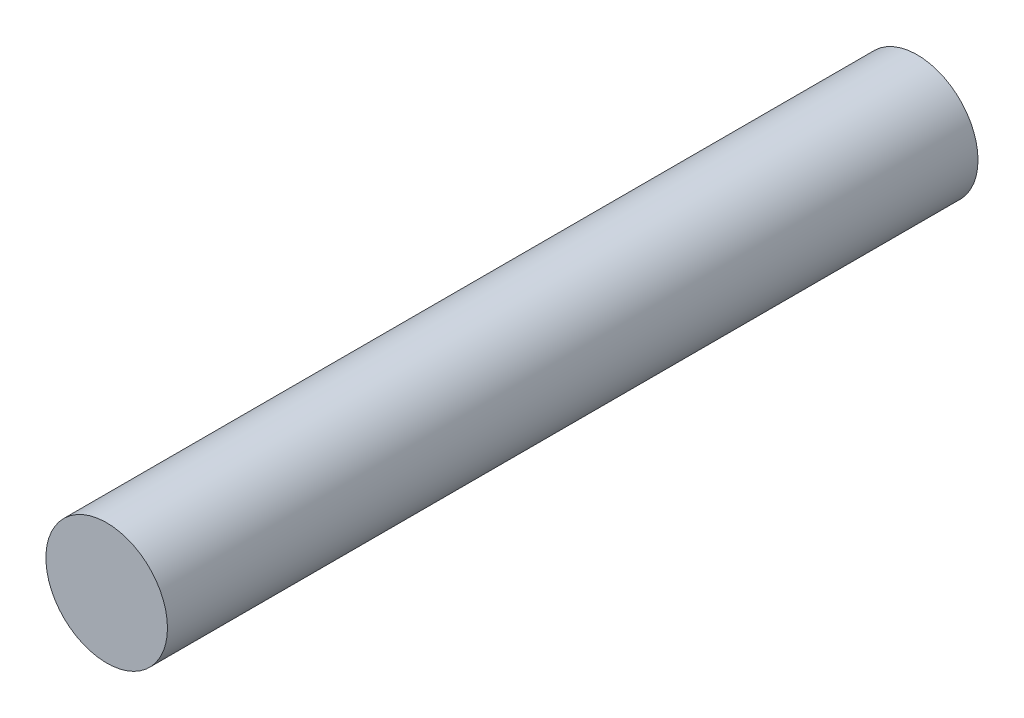
ISO-10303-21;
HEADER;
FILE_DESCRIPTION(('STEP AP214'),'2;1');
FILE_NAME('part.step','',(''),(''),'','','');
FILE_SCHEMA(('AUTOMOTIVE_DESIGN { 1 0 10303 214 1 1 1 1 }'));
ENDSEC;
DATA;
#1=APPLICATION_CONTEXT('core data for automotive mechanical design processes');
#2=APPLICATION_PROTOCOL_DEFINITION('international standard','automotive_design',2000,#1);
#3=PRODUCT_CONTEXT('',#1,'mechanical');
#4=PRODUCT('Part','Part','',(#3));
#5=PRODUCT_RELATED_PRODUCT_CATEGORY('part','',(#4));
#6=PRODUCT_DEFINITION_FORMATION('','',#4);
#7=PRODUCT_DEFINITION_CONTEXT('part definition',#1,'design');
#8=PRODUCT_DEFINITION('design','',#6,#7);
#9=PRODUCT_DEFINITION_SHAPE('','',#8);
#10=(LENGTH_UNIT() NAMED_UNIT(*) SI_UNIT(.MILLI.,.METRE.));
#11=(NAMED_UNIT(*) PLANE_ANGLE_UNIT() SI_UNIT($,.RADIAN.));
#12=(NAMED_UNIT(*) SI_UNIT($,.STERADIAN.) SOLID_ANGLE_UNIT());
#13=UNCERTAINTY_MEASURE_WITH_UNIT(LENGTH_MEASURE(1.E-05),#10,'distance_accuracy_value','');
#14=(GEOMETRIC_REPRESENTATION_CONTEXT(3) GLOBAL_UNCERTAINTY_ASSIGNED_CONTEXT((#13)) GLOBAL_UNIT_ASSIGNED_CONTEXT((#10,
#11,#12)) REPRESENTATION_CONTEXT('',''));
#15=CARTESIAN_POINT('',(0.,0.,0.));
#16=DIRECTION('',(0.,0.,1.));
#17=DIRECTION('',(1.,0.,0.));
#18=AXIS2_PLACEMENT_3D('',#15,#16,#17);
#19=CARTESIAN_POINT('',(0.,0.,10.));
#20=DIRECTION('',(0.,0.,-1.));
#21=DIRECTION('',(-1.,0.,0.));
#22=AXIS2_PLACEMENT_3D('',#19,#20,#21);
#23=CYLINDRICAL_SURFACE('',#22,0.75);
#24=CARTESIAN_POINT('',(0.,0.,10.));
#25=DIRECTION('',(0.,0.,1.));
#26=DIRECTION('',(1.,0.,0.));
#27=AXIS2_PLACEMENT_3D('',#24,#25,#26);
#28=CIRCLE('',#27,0.75);
#29=CARTESIAN_POINT('',(0.75,0.,10.));
#30=VERTEX_POINT('',#29);
#31=EDGE_CURVE('E10',#30,#30,#28,.T.);
#32=ORIENTED_EDGE('',*,*,#31,.F.);
#33=EDGE_LOOP('',(#32));
#34=FACE_BOUND('',#33,.T.);
#35=CARTESIAN_POINT('',(0.,0.,0.));
#36=DIRECTION('',(0.,0.,1.));
#37=DIRECTION('',(1.,0.,0.));
#38=AXIS2_PLACEMENT_3D('',#35,#36,#37);
#39=CIRCLE('',#38,0.75);
#40=CARTESIAN_POINT('',(0.75,0.,0.));
#41=VERTEX_POINT('',#40);
#42=EDGE_CURVE('E40',#41,#41,#39,.T.);
#43=ORIENTED_EDGE('',*,*,#42,.T.);
#44=EDGE_LOOP('',(#43));
#45=FACE_BOUND('',#44,.T.);
#46=ADVANCED_FACE('F37',(#34,#45),#23,.T.);
#47=CARTESIAN_POINT('',(0.,0.,10.));
#48=DIRECTION('',(0.,0.,1.));
#49=DIRECTION('',(1.,0.,0.));
#50=AXIS2_PLACEMENT_3D('',#47,#48,#49);
#51=PLANE('',#50);
#52=ORIENTED_EDGE('',*,*,#31,.T.);
#53=EDGE_LOOP('',(#52));
#54=FACE_BOUND('',#53,.T.);
#55=ADVANCED_FACE('F54',(#54),#51,.T.);
#56=CARTESIAN_POINT('',(0.,0.,0.));
#57=DIRECTION('',(0.,0.,1.));
#58=DIRECTION('',(1.,0.,0.));
#59=AXIS2_PLACEMENT_3D('',#56,#57,#58);
#60=PLANE('',#59);
#61=ORIENTED_EDGE('',*,*,#42,.F.);
#62=EDGE_LOOP('',(#61));
#63=FACE_BOUND('',#62,.T.);
#64=ADVANCED_FACE('F52',(#63),#60,.F.);
#65=CLOSED_SHELL('',(#46,#55,#64));
#66=MANIFOLD_SOLID_BREP('B2',#65);
#67=ADVANCED_BREP_SHAPE_REPRESENTATION('',(#18,#66),#14);
#68=SHAPE_DEFINITION_REPRESENTATION(#9,#67);
ENDSEC;
END-ISO-10303-21;
